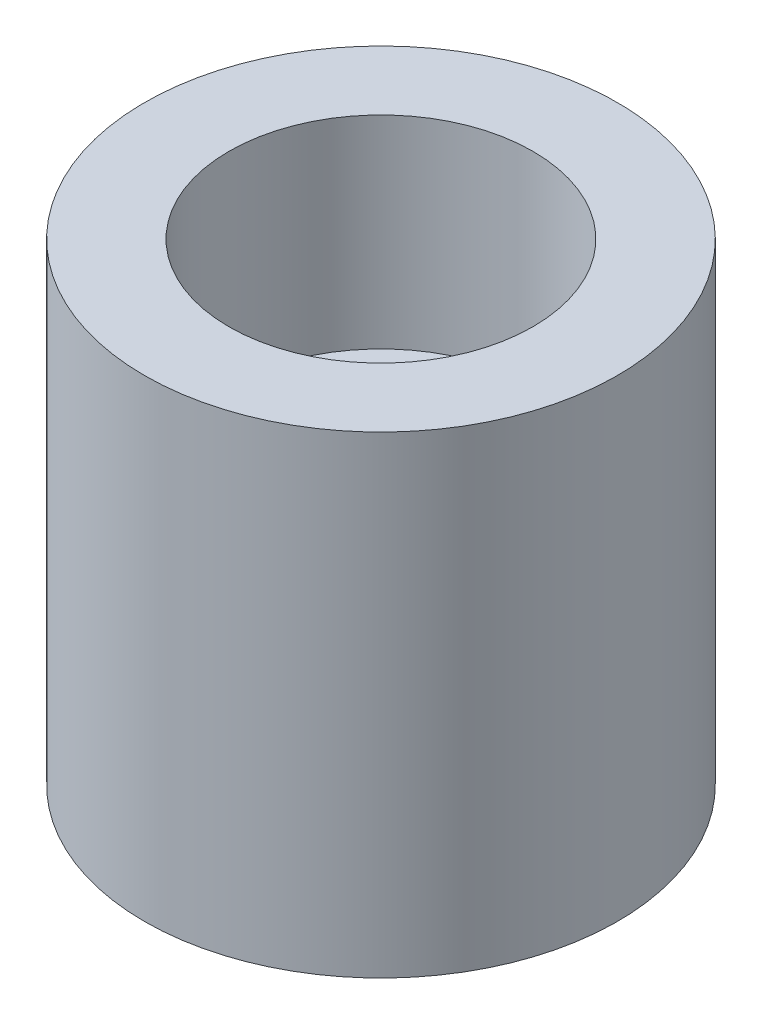
ISO-10303-21;
HEADER;
FILE_DESCRIPTION(('STEP AP214'),'2;1');
FILE_NAME('part.step','',(''),(''),'','','');
FILE_SCHEMA(('AUTOMOTIVE_DESIGN { 1 0 10303 214 1 1 1 1 }'));
ENDSEC;
DATA;
#1=APPLICATION_CONTEXT('core data for automotive mechanical design processes');
#2=APPLICATION_PROTOCOL_DEFINITION('international standard','automotive_design',2000,#1);
#3=PRODUCT_CONTEXT('',#1,'mechanical');
#4=PRODUCT('Part','Part','',(#3));
#5=PRODUCT_RELATED_PRODUCT_CATEGORY('part','',(#4));
#6=PRODUCT_DEFINITION_FORMATION('','',#4);
#7=PRODUCT_DEFINITION_CONTEXT('part definition',#1,'design');
#8=PRODUCT_DEFINITION('design','',#6,#7);
#9=PRODUCT_DEFINITION_SHAPE('','',#8);
#10=(LENGTH_UNIT() NAMED_UNIT(*) SI_UNIT(.MILLI.,.METRE.));
#11=(NAMED_UNIT(*) PLANE_ANGLE_UNIT() SI_UNIT($,.RADIAN.));
#12=(NAMED_UNIT(*) SI_UNIT($,.STERADIAN.) SOLID_ANGLE_UNIT());
#13=UNCERTAINTY_MEASURE_WITH_UNIT(LENGTH_MEASURE(1.E-05),#10,'distance_accuracy_value','');
#14=(GEOMETRIC_REPRESENTATION_CONTEXT(3) GLOBAL_UNCERTAINTY_ASSIGNED_CONTEXT((#13)) GLOBAL_UNIT_ASSIGNED_CONTEXT((#10,
#11,#12)) REPRESENTATION_CONTEXT('',''));
#15=CARTESIAN_POINT('',(0.,0.,0.));
#16=DIRECTION('',(0.,0.,1.));
#17=DIRECTION('',(1.,0.,0.));
#18=AXIS2_PLACEMENT_3D('',#15,#16,#17);
#19=CARTESIAN_POINT('',(0.,7.,0.));
#20=DIRECTION('',(0.,-1.,0.));
#21=DIRECTION('',(0.,0.,-1.));
#22=AXIS2_PLACEMENT_3D('',#19,#20,#21);
#23=CYLINDRICAL_SURFACE('',#22,3.5);
#24=CARTESIAN_POINT('',(0.,7.,0.));
#25=DIRECTION('',(0.,1.,0.));
#26=DIRECTION('',(0.,0.,1.));
#27=AXIS2_PLACEMENT_3D('',#24,#25,#26);
#28=CIRCLE('',#27,3.5);
#29=CARTESIAN_POINT('',(0.,7.,3.5));
#30=VERTEX_POINT('',#29);
#31=EDGE_CURVE('E10',#30,#30,#28,.T.);
#32=ORIENTED_EDGE('',*,*,#31,.F.);
#33=EDGE_LOOP('',(#32));
#34=FACE_BOUND('',#33,.T.);
#35=CARTESIAN_POINT('',(0.,0.,0.));
#36=DIRECTION('',(0.,1.,0.));
#37=DIRECTION('',(0.,0.,1.));
#38=AXIS2_PLACEMENT_3D('',#35,#36,#37);
#39=CIRCLE('',#38,3.5);
#40=CARTESIAN_POINT('',(0.,0.,3.5));
#41=VERTEX_POINT('',#40);
#42=EDGE_CURVE('E40',#41,#41,#39,.T.);
#43=ORIENTED_EDGE('',*,*,#42,.T.);
#44=EDGE_LOOP('',(#43));
#45=FACE_BOUND('',#44,.T.);
#46=ADVANCED_FACE('F37',(#34,#45),#23,.T.);
#47=CARTESIAN_POINT('',(0.,7.,0.));
#48=DIRECTION('',(0.,1.,0.));
#49=DIRECTION('',(0.,0.,1.));
#50=AXIS2_PLACEMENT_3D('',#47,#48,#49);
#51=PLANE('',#50);
#52=CARTESIAN_POINT('',(0.,7.,0.));
#53=DIRECTION('',(0.,1.,0.));
#54=DIRECTION('',(0.,0.,1.));
#55=AXIS2_PLACEMENT_3D('',#52,#53,#54);
#56=CIRCLE('',#55,2.25);
#57=CARTESIAN_POINT('',(0.,7.,2.25));
#58=VERTEX_POINT('',#57);
#59=EDGE_CURVE('E49',#58,#58,#56,.T.);
#60=ORIENTED_EDGE('',*,*,#59,.F.);
#61=EDGE_LOOP('',(#60));
#62=FACE_BOUND('',#61,.T.);
#63=ORIENTED_EDGE('',*,*,#31,.T.);
#64=EDGE_LOOP('',(#63));
#65=FACE_BOUND('',#64,.T.);
#66=ADVANCED_FACE('F74',(#62,#65),#51,.T.);
#67=CARTESIAN_POINT('',(0.,0.,0.));
#68=DIRECTION('',(0.,1.,0.));
#69=DIRECTION('',(0.,0.,1.));
#70=AXIS2_PLACEMENT_3D('',#67,#68,#69);
#71=PLANE('',#70);
#72=CARTESIAN_POINT('',(0.,0.,0.));
#73=DIRECTION('',(0.,-1.,0.));
#74=DIRECTION('',(0.,0.,-1.));
#75=AXIS2_PLACEMENT_3D('',#72,#73,#74);
#76=CIRCLE('',#75,2.25);
#77=CARTESIAN_POINT('',(0.,0.,-2.25));
#78=VERTEX_POINT('',#77);
#79=EDGE_CURVE('E55',#78,#78,#76,.T.);
#80=ORIENTED_EDGE('',*,*,#79,.F.);
#81=EDGE_LOOP('',(#80));
#82=FACE_BOUND('',#81,.T.);
#83=ORIENTED_EDGE('',*,*,#42,.F.);
#84=EDGE_LOOP('',(#83));
#85=FACE_BOUND('',#84,.T.);
#86=ADVANCED_FACE('F70',(#82,#85),#71,.F.);
#87=CARTESIAN_POINT('',(0.,4.,0.));
#88=DIRECTION('',(0.,1.,0.));
#89=DIRECTION('',(0.,0.,1.));
#90=AXIS2_PLACEMENT_3D('',#87,#88,#89);
#91=CYLINDRICAL_SURFACE('',#90,2.25);
#92=CARTESIAN_POINT('',(0.,4.,0.));
#93=DIRECTION('',(0.,1.,0.));
#94=DIRECTION('',(0.,0.,1.));
#95=AXIS2_PLACEMENT_3D('',#92,#93,#94);
#96=CIRCLE('',#95,2.25);
#97=CARTESIAN_POINT('',(0.,4.,2.25));
#98=VERTEX_POINT('',#97);
#99=EDGE_CURVE('E47',#98,#98,#96,.T.);
#100=ORIENTED_EDGE('',*,*,#99,.F.);
#101=EDGE_LOOP('',(#100));
#102=FACE_BOUND('',#101,.T.);
#103=ORIENTED_EDGE('',*,*,#59,.T.);
#104=EDGE_LOOP('',(#103));
#105=FACE_BOUND('',#104,.T.);
#106=ADVANCED_FACE('F73',(#102,#105),#91,.F.);
#107=CARTESIAN_POINT('',(0.,4.,0.));
#108=DIRECTION('',(0.,1.,0.));
#109=DIRECTION('',(0.,0.,1.));
#110=AXIS2_PLACEMENT_3D('',#107,#108,#109);
#111=PLANE('',#110);
#112=ORIENTED_EDGE('',*,*,#99,.T.);
#113=EDGE_LOOP('',(#112));
#114=FACE_BOUND('',#113,.T.);
#115=ADVANCED_FACE('F66',(#114),#111,.T.);
#116=CARTESIAN_POINT('',(0.,1.5,0.));
#117=DIRECTION('',(0.,-1.,0.));
#118=DIRECTION('',(0.,0.,-1.));
#119=AXIS2_PLACEMENT_3D('',#116,#117,#118);
#120=CYLINDRICAL_SURFACE('',#119,2.25);
#121=CARTESIAN_POINT('',(0.,1.5,0.));
#122=DIRECTION('',(0.,-1.,0.));
#123=DIRECTION('',(0.,0.,-1.));
#124=AXIS2_PLACEMENT_3D('',#121,#122,#123);
#125=CIRCLE('',#124,2.25);
#126=CARTESIAN_POINT('',(0.,1.5,-2.25));
#127=VERTEX_POINT('',#126);
#128=EDGE_CURVE('E52',#127,#127,#125,.T.);
#129=ORIENTED_EDGE('',*,*,#128,.F.);
#130=EDGE_LOOP('',(#129));
#131=FACE_BOUND('',#130,.T.);
#132=ORIENTED_EDGE('',*,*,#79,.T.);
#133=EDGE_LOOP('',(#132));
#134=FACE_BOUND('',#133,.T.);
#135=ADVANCED_FACE('F63',(#131,#134),#120,.F.);
#136=CARTESIAN_POINT('',(0.,1.5,0.));
#137=DIRECTION('',(0.,-1.,0.));
#138=DIRECTION('',(0.,0.,-1.));
#139=AXIS2_PLACEMENT_3D('',#136,#137,#138);
#140=PLANE('',#139);
#141=ORIENTED_EDGE('',*,*,#128,.T.);
#142=EDGE_LOOP('',(#141));
#143=FACE_BOUND('',#142,.T.);
#144=ADVANCED_FACE('F61',(#143),#140,.T.);
#145=CLOSED_SHELL('',(#46,#66,#86,#106,#115,#135,#144));
#146=MANIFOLD_SOLID_BREP('B2',#145);
#147=ADVANCED_BREP_SHAPE_REPRESENTATION('',(#18,#146),#14);
#148=SHAPE_DEFINITION_REPRESENTATION(#9,#147);
ENDSEC;
END-ISO-10303-21;
